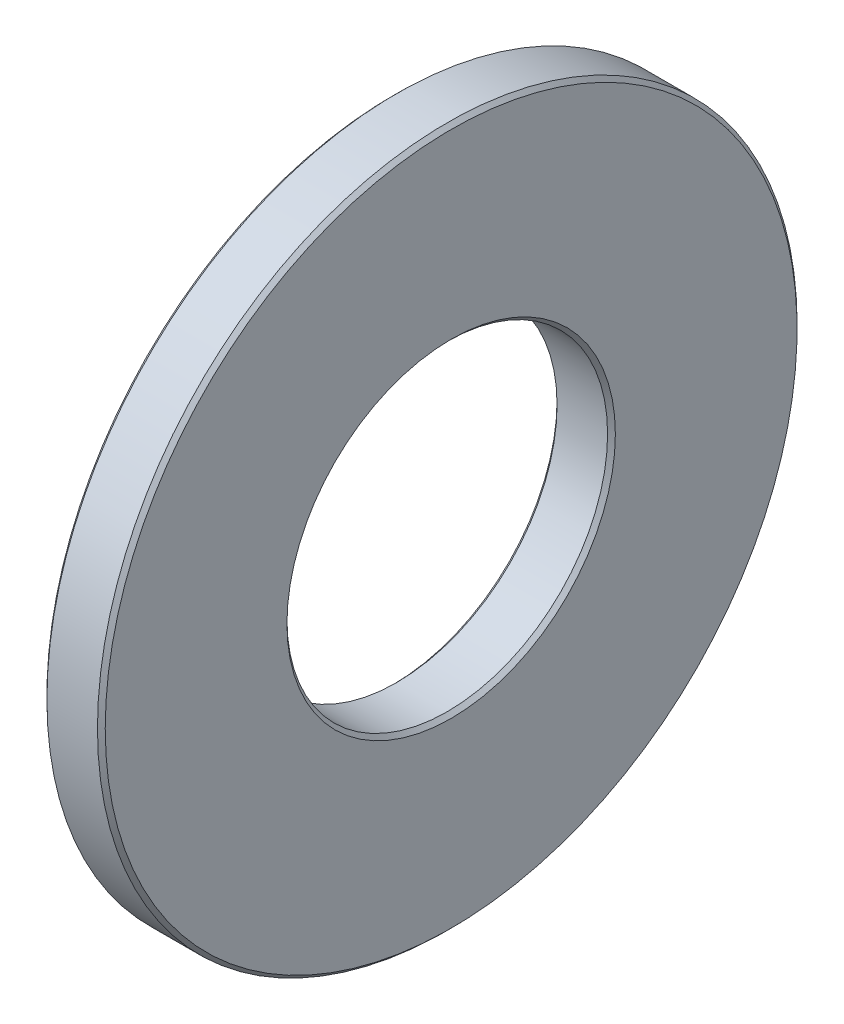
ISO-10303-21;
HEADER;
FILE_DESCRIPTION(('STEP AP214'),'2;1');
FILE_NAME('part.step','',(''),(''),'','','');
FILE_SCHEMA(('AUTOMOTIVE_DESIGN { 1 0 10303 214 1 1 1 1 }'));
ENDSEC;
DATA;
#1=APPLICATION_CONTEXT('core data for automotive mechanical design processes');
#2=APPLICATION_PROTOCOL_DEFINITION('international standard','automotive_design',2000,#1);
#3=PRODUCT_CONTEXT('',#1,'mechanical');
#4=PRODUCT('Part','Part','',(#3));
#5=PRODUCT_RELATED_PRODUCT_CATEGORY('part','',(#4));
#6=PRODUCT_DEFINITION_FORMATION('','',#4);
#7=PRODUCT_DEFINITION_CONTEXT('part definition',#1,'design');
#8=PRODUCT_DEFINITION('design','',#6,#7);
#9=PRODUCT_DEFINITION_SHAPE('','',#8);
#10=(LENGTH_UNIT() NAMED_UNIT(*) SI_UNIT(.MILLI.,.METRE.));
#11=(NAMED_UNIT(*) PLANE_ANGLE_UNIT() SI_UNIT($,.RADIAN.));
#12=(NAMED_UNIT(*) SI_UNIT($,.STERADIAN.) SOLID_ANGLE_UNIT());
#13=UNCERTAINTY_MEASURE_WITH_UNIT(LENGTH_MEASURE(1.E-05),#10,'distance_accuracy_value','');
#14=(GEOMETRIC_REPRESENTATION_CONTEXT(3) GLOBAL_UNCERTAINTY_ASSIGNED_CONTEXT((#13)) GLOBAL_UNIT_ASSIGNED_CONTEXT((#10,
#11,#12)) REPRESENTATION_CONTEXT('',''));
#15=CARTESIAN_POINT('',(0.,0.,0.));
#16=DIRECTION('',(0.,0.,1.));
#17=DIRECTION('',(1.,0.,0.));
#18=AXIS2_PLACEMENT_3D('',#15,#16,#17);
#19=CARTESIAN_POINT('',(0.,4.125,0.));
#20=DIRECTION('',(1.,0.,0.));
#21=DIRECTION('',(0.,0.,-1.));
#22=AXIS2_PLACEMENT_3D('',#19,#20,#21);
#23=PLANE('',#22);
#24=CARTESIAN_POINT('',(0.,0.,0.));
#25=DIRECTION('',(1.,0.,0.));
#26=DIRECTION('',(0.,0.,-1.));
#27=AXIS2_PLACEMENT_3D('',#24,#25,#26);
#28=CIRCLE('',#27,4.225);
#29=CARTESIAN_POINT('',(0.,0.,-4.225));
#30=VERTEX_POINT('',#29);
#31=EDGE_CURVE('E51',#30,#30,#28,.T.);
#32=ORIENTED_EDGE('',*,*,#31,.T.);
#33=EDGE_LOOP('',(#32));
#34=FACE_BOUND('',#33,.T.);
#35=CARTESIAN_POINT('',(0.,0.,0.));
#36=DIRECTION('',(1.,0.,0.));
#37=DIRECTION('',(0.,0.,-1.));
#38=AXIS2_PLACEMENT_3D('',#35,#36,#37);
#39=CIRCLE('',#38,8.9);
#40=CARTESIAN_POINT('',(0.,0.,-8.9));
#41=VERTEX_POINT('',#40);
#42=EDGE_CURVE('E55',#41,#41,#39,.F.);
#43=ORIENTED_EDGE('',*,*,#42,.T.);
#44=EDGE_LOOP('',(#43));
#45=FACE_BOUND('',#44,.T.);
#46=ADVANCED_FACE('F38',(#34,#45),#23,.F.);
#47=CARTESIAN_POINT('',(0.,0.,0.));
#48=DIRECTION('',(-1.,0.,0.));
#49=DIRECTION('',(0.,0.,1.));
#50=AXIS2_PLACEMENT_3D('',#47,#48,#49);
#51=CYLINDRICAL_SURFACE('',#50,9.);
#52=CARTESIAN_POINT('',(1.4,0.,0.));
#53=DIRECTION('',(-1.,0.,0.));
#54=DIRECTION('',(0.,0.,1.));
#55=AXIS2_PLACEMENT_3D('',#52,#53,#54);
#56=CIRCLE('',#55,9.);
#57=CARTESIAN_POINT('',(1.4,0.,9.));
#58=VERTEX_POINT('',#57);
#59=EDGE_CURVE('E11',#58,#58,#56,.T.);
#60=ORIENTED_EDGE('',*,*,#59,.T.);
#61=EDGE_LOOP('',(#60));
#62=FACE_BOUND('',#61,.T.);
#63=CARTESIAN_POINT('',(0.0999999999999977,0.,0.));
#64=DIRECTION('',(1.,0.,0.));
#65=DIRECTION('',(0.,0.,-1.));
#66=AXIS2_PLACEMENT_3D('',#63,#64,#65);
#67=CIRCLE('',#66,9.);
#68=CARTESIAN_POINT('',(0.0999999999999977,0.,-9.));
#69=VERTEX_POINT('',#68);
#70=EDGE_CURVE('E46',#69,#69,#67,.T.);
#71=ORIENTED_EDGE('',*,*,#70,.T.);
#72=EDGE_LOOP('',(#71));
#73=FACE_BOUND('',#72,.T.);
#74=ADVANCED_FACE('F91',(#62,#73),#51,.T.);
#75=CARTESIAN_POINT('',(1.5,4.125,0.));
#76=DIRECTION('',(-1.,0.,0.));
#77=DIRECTION('',(0.,0.,1.));
#78=AXIS2_PLACEMENT_3D('',#75,#76,#77);
#79=PLANE('',#78);
#80=CARTESIAN_POINT('',(1.5,0.,0.));
#81=DIRECTION('',(-1.,0.,0.));
#82=DIRECTION('',(0.,0.,1.));
#83=AXIS2_PLACEMENT_3D('',#80,#81,#82);
#84=CIRCLE('',#83,4.225);
#85=CARTESIAN_POINT('',(1.5,0.,-4.225));
#86=VERTEX_POINT('',#85);
#87=EDGE_CURVE('E66',#86,#86,#84,.T.);
#88=ORIENTED_EDGE('',*,*,#87,.T.);
#89=EDGE_LOOP('',(#88));
#90=FACE_BOUND('',#89,.T.);
#91=CARTESIAN_POINT('',(1.5,0.,0.));
#92=DIRECTION('',(-1.,0.,0.));
#93=DIRECTION('',(0.,0.,1.));
#94=AXIS2_PLACEMENT_3D('',#91,#92,#93);
#95=CIRCLE('',#94,8.9);
#96=CARTESIAN_POINT('',(1.5,0.,8.9));
#97=VERTEX_POINT('',#96);
#98=EDGE_CURVE('E69',#97,#97,#95,.F.);
#99=ORIENTED_EDGE('',*,*,#98,.T.);
#100=EDGE_LOOP('',(#99));
#101=FACE_BOUND('',#100,.T.);
#102=ADVANCED_FACE('F73',(#90,#101),#79,.F.);
#103=CARTESIAN_POINT('',(0.,0.,0.));
#104=DIRECTION('',(-1.,0.,0.));
#105=DIRECTION('',(0.,0.,1.));
#106=AXIS2_PLACEMENT_3D('',#103,#104,#105);
#107=CYLINDRICAL_SURFACE('',#106,4.125);
#108=CARTESIAN_POINT('',(1.4,0.,0.));
#109=DIRECTION('',(-1.,0.,0.));
#110=DIRECTION('',(0.,0.,1.));
#111=AXIS2_PLACEMENT_3D('',#108,#109,#110);
#112=CIRCLE('',#111,4.125);
#113=CARTESIAN_POINT('',(1.4,0.,-4.125));
#114=VERTEX_POINT('',#113);
#115=EDGE_CURVE('E60',#114,#114,#112,.F.);
#116=ORIENTED_EDGE('',*,*,#115,.T.);
#117=EDGE_LOOP('',(#116));
#118=FACE_BOUND('',#117,.T.);
#119=CARTESIAN_POINT('',(0.1,0.,0.));
#120=DIRECTION('',(1.,0.,0.));
#121=DIRECTION('',(0.,0.,-1.));
#122=AXIS2_PLACEMENT_3D('',#119,#120,#121);
#123=CIRCLE('',#122,4.125);
#124=CARTESIAN_POINT('',(0.1,0.,-4.125));
#125=VERTEX_POINT('',#124);
#126=EDGE_CURVE('E63',#125,#125,#123,.F.);
#127=ORIENTED_EDGE('',*,*,#126,.T.);
#128=EDGE_LOOP('',(#127));
#129=FACE_BOUND('',#128,.T.);
#130=ADVANCED_FACE('F103',(#118,#129),#107,.F.);
#131=CARTESIAN_POINT('',(1.5,0.,0.));
#132=DIRECTION('',(1.,0.,0.));
#133=DIRECTION('',(0.,0.,-1.));
#134=AXIS2_PLACEMENT_3D('',#131,#132,#133);
#135=CONICAL_SURFACE('',#134,4.225,0.78539816339745);
#136=CARTESIAN_POINT('',(1.4,0.,-4.125));
#137=CARTESIAN_POINT('',(1.40104166666667,0.,-4.12604166666667));
#138=CARTESIAN_POINT('',(1.40208333333333,0.,-4.12708333333333));
#139=CARTESIAN_POINT('',(1.40416666666667,0.,-4.12916666666667));
#140=CARTESIAN_POINT('',(1.40520833333333,0.,-4.13020833333333));
#141=CARTESIAN_POINT('',(1.40729166666667,0.,-4.13229166666667));
#142=CARTESIAN_POINT('',(1.40833333333333,0.,-4.13333333333333));
#143=CARTESIAN_POINT('',(1.41041666666667,0.,-4.13541666666667));
#144=CARTESIAN_POINT('',(1.41145833333333,0.,-4.13645833333333));
#145=CARTESIAN_POINT('',(1.41354166666667,0.,-4.13854166666667));
#146=CARTESIAN_POINT('',(1.41458333333333,0.,-4.13958333333333));
#147=CARTESIAN_POINT('',(1.41666666666667,0.,-4.14166666666667));
#148=CARTESIAN_POINT('',(1.41770833333333,0.,-4.14270833333333));
#149=CARTESIAN_POINT('',(1.41979166666667,0.,-4.14479166666667));
#150=CARTESIAN_POINT('',(1.42083333333333,0.,-4.14583333333333));
#151=CARTESIAN_POINT('',(1.42291666666667,0.,-4.14791666666667));
#152=CARTESIAN_POINT('',(1.42395833333333,0.,-4.14895833333333));
#153=CARTESIAN_POINT('',(1.42604166666667,0.,-4.15104166666667));
#154=CARTESIAN_POINT('',(1.42708333333333,0.,-4.15208333333333));
#155=CARTESIAN_POINT('',(1.42916666666667,0.,-4.15416666666667));
#156=CARTESIAN_POINT('',(1.43020833333333,0.,-4.15520833333333));
#157=CARTESIAN_POINT('',(1.43229166666667,0.,-4.15729166666667));
#158=CARTESIAN_POINT('',(1.43333333333333,0.,-4.15833333333333));
#159=CARTESIAN_POINT('',(1.43541666666667,0.,-4.16041666666667));
#160=CARTESIAN_POINT('',(1.43645833333333,0.,-4.16145833333333));
#161=CARTESIAN_POINT('',(1.43854166666667,0.,-4.16354166666667));
#162=CARTESIAN_POINT('',(1.43958333333333,0.,-4.16458333333333));
#163=CARTESIAN_POINT('',(1.44166666666667,0.,-4.16666666666667));
#164=CARTESIAN_POINT('',(1.44270833333333,0.,-4.16770833333333));
#165=CARTESIAN_POINT('',(1.44479166666667,0.,-4.16979166666667));
#166=CARTESIAN_POINT('',(1.44583333333333,0.,-4.17083333333333));
#167=CARTESIAN_POINT('',(1.44791666666667,0.,-4.17291666666667));
#168=CARTESIAN_POINT('',(1.44895833333333,0.,-4.17395833333333));
#169=CARTESIAN_POINT('',(1.45104166666667,0.,-4.17604166666667));
#170=CARTESIAN_POINT('',(1.45208333333333,0.,-4.17708333333333));
#171=CARTESIAN_POINT('',(1.45416666666667,0.,-4.17916666666667));
#172=CARTESIAN_POINT('',(1.45520833333333,0.,-4.18020833333333));
#173=CARTESIAN_POINT('',(1.45729166666667,0.,-4.18229166666667));
#174=CARTESIAN_POINT('',(1.45833333333333,0.,-4.18333333333333));
#175=CARTESIAN_POINT('',(1.46041666666667,0.,-4.18541666666667));
#176=CARTESIAN_POINT('',(1.46145833333333,0.,-4.18645833333333));
#177=CARTESIAN_POINT('',(1.46354166666667,0.,-4.18854166666667));
#178=CARTESIAN_POINT('',(1.46458333333333,0.,-4.18958333333333));
#179=CARTESIAN_POINT('',(1.46666666666667,0.,-4.19166666666667));
#180=CARTESIAN_POINT('',(1.46770833333333,0.,-4.19270833333333));
#181=CARTESIAN_POINT('',(1.46979166666667,0.,-4.19479166666667));
#182=CARTESIAN_POINT('',(1.47083333333333,0.,-4.19583333333333));
#183=CARTESIAN_POINT('',(1.47291666666667,0.,-4.19791666666667));
#184=CARTESIAN_POINT('',(1.47395833333333,0.,-4.19895833333333));
#185=CARTESIAN_POINT('',(1.47604166666667,0.,-4.20104166666667));
#186=CARTESIAN_POINT('',(1.47708333333333,0.,-4.20208333333333));
#187=CARTESIAN_POINT('',(1.47916666666667,0.,-4.20416666666667));
#188=CARTESIAN_POINT('',(1.48020833333333,0.,-4.20520833333333));
#189=CARTESIAN_POINT('',(1.48229166666667,0.,-4.20729166666667));
#190=CARTESIAN_POINT('',(1.48333333333333,0.,-4.20833333333333));
#191=CARTESIAN_POINT('',(1.48541666666667,0.,-4.21041666666667));
#192=CARTESIAN_POINT('',(1.48645833333333,0.,-4.21145833333333));
#193=CARTESIAN_POINT('',(1.48854166666667,0.,-4.21354166666667));
#194=CARTESIAN_POINT('',(1.48958333333333,0.,-4.21458333333333));
#195=CARTESIAN_POINT('',(1.49166666666667,0.,-4.21666666666667));
#196=CARTESIAN_POINT('',(1.49270833333333,0.,-4.21770833333333));
#197=CARTESIAN_POINT('',(1.49479166666667,0.,-4.21979166666667));
#198=CARTESIAN_POINT('',(1.49583333333333,0.,-4.22083333333333));
#199=CARTESIAN_POINT('',(1.49791666666667,0.,-4.22291666666667));
#200=CARTESIAN_POINT('',(1.49895833333333,0.,-4.22395833333333));
#201=CARTESIAN_POINT('',(1.5,0.,-4.225));
#202=B_SPLINE_CURVE_WITH_KNOTS('',3,(#136,#137,#138,#139,#140,#141,#142,#143,#144,#145,#146,
#147,#148,#149,#150,#151,#152,#153,#154,#155,#156,#157,#158,#159,#160,#161,#162,#163,#164,#165,
#166,#167,#168,#169,#170,#171,#172,#173,#174,#175,#176,#177,#178,#179,#180,#181,#182,#183,#184,
#185,#186,#187,#188,#189,#190,#191,#192,#193,#194,#195,#196,#197,#198,#199,#200,#201),
.UNSPECIFIED.,.F.,.F.,(4,2,2,2,2,2,2,2,2,2,2,2,2,2,2,2,2,2,2,2,2,2,2,2,2,2,2,2,2,2,2,2,4),(0.,
0.0044194173824162,0.00883883476483194,0.0132582521472475,0.0176776695296639,0.0220970869120795,
0.0265165042944958,0.0309359216769116,0.0353553390593272,0.0397747564417435,0.0441941738241591,
0.0486135912065755,0.0530330085889911,0.0574524259714068,0.061871843353823,0.0662912607362387,
0.0707106781186551,0.0751300955010707,0.0795495128834864,0.0839689302659026,0.0883883476483184,
0.0928077650307346,0.0972271824131503,0.101646599795566,0.106066017177982,0.110485434560398,
0.114904851942814,0.11932426932523,0.123743686707646,0.128163104090062,0.132582521472477,
0.137001938854894,0.141421356237309),.UNSPECIFIED.);
#203=EDGE_CURVE('BSEAM87',#114,#86,#202,.T.);
#204=ORIENTED_EDGE('',*,*,#115,.F.);
#205=ORIENTED_EDGE('',*,*,#87,.F.);
#206=ORIENTED_EDGE('',*,*,#203,.T.);
#207=ORIENTED_EDGE('',*,*,#203,.F.);
#208=EDGE_LOOP('',(#204,#206,#205,#207));
#209=FACE_BOUND('',#208,.T.);
#210=ADVANCED_FACE('F87',(#209),#135,.F.);
#211=CARTESIAN_POINT('',(0.1,0.,0.));
#212=DIRECTION('',(-1.,0.,0.));
#213=DIRECTION('',(0.,0.,1.));
#214=AXIS2_PLACEMENT_3D('',#211,#212,#213);
#215=CONICAL_SURFACE('',#214,4.125,0.785398163397448);
#216=ORIENTED_EDGE('',*,*,#31,.F.);
#217=EDGE_LOOP('',(#216));
#218=FACE_BOUND('',#217,.T.);
#219=ORIENTED_EDGE('',*,*,#126,.F.);
#220=EDGE_LOOP('',(#219));
#221=FACE_BOUND('',#220,.T.);
#222=ADVANCED_FACE('F79',(#218,#221),#215,.F.);
#223=CARTESIAN_POINT('',(1.4,0.,0.));
#224=DIRECTION('',(-1.,0.,0.));
#225=DIRECTION('',(0.,0.,1.));
#226=AXIS2_PLACEMENT_3D('',#223,#224,#225);
#227=CONICAL_SURFACE('',#226,9.,0.785398163397455);
#228=ORIENTED_EDGE('',*,*,#98,.F.);
#229=EDGE_LOOP('',(#228));
#230=FACE_BOUND('',#229,.T.);
#231=ORIENTED_EDGE('',*,*,#59,.F.);
#232=EDGE_LOOP('',(#231));
#233=FACE_BOUND('',#232,.T.);
#234=ADVANCED_FACE('F75',(#230,#233),#227,.T.);
#235=CARTESIAN_POINT('',(0.,0.,0.));
#236=DIRECTION('',(1.,0.,0.));
#237=DIRECTION('',(0.,0.,-1.));
#238=AXIS2_PLACEMENT_3D('',#235,#236,#237);
#239=CONICAL_SURFACE('',#238,8.9,0.785398163397457);
#240=ORIENTED_EDGE('',*,*,#70,.F.);
#241=EDGE_LOOP('',(#240));
#242=FACE_BOUND('',#241,.T.);
#243=ORIENTED_EDGE('',*,*,#42,.F.);
#244=EDGE_LOOP('',(#243));
#245=FACE_BOUND('',#244,.T.);
#246=ADVANCED_FACE('F78',(#242,#245),#239,.T.);
#247=CLOSED_SHELL('',(#46,#74,#102,#130,#210,#222,#234,#246));
#248=MANIFOLD_SOLID_BREP('B2',#247);
#249=ADVANCED_BREP_SHAPE_REPRESENTATION('',(#18,#248),#14);
#250=SHAPE_DEFINITION_REPRESENTATION(#9,#249);
ENDSEC;
END-ISO-10303-21;
